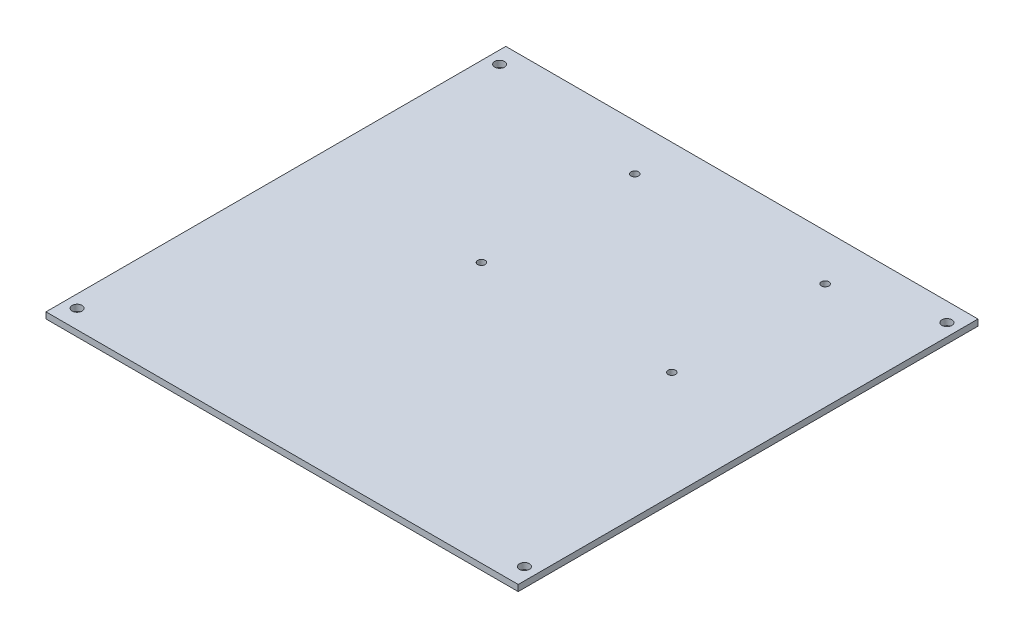
ISO-10303-21;
HEADER;
FILE_DESCRIPTION(('STEP AP214'),'2;1');
FILE_NAME('part.step','',(''),(''),'','','');
FILE_SCHEMA(('AUTOMOTIVE_DESIGN { 1 0 10303 214 1 1 1 1 }'));
ENDSEC;
DATA;
#1=APPLICATION_CONTEXT('core data for automotive mechanical design processes');
#2=APPLICATION_PROTOCOL_DEFINITION('international standard','automotive_design',2000,#1);
#3=PRODUCT_CONTEXT('',#1,'mechanical');
#4=PRODUCT('Part','Part','',(#3));
#5=PRODUCT_RELATED_PRODUCT_CATEGORY('part','',(#4));
#6=PRODUCT_DEFINITION_FORMATION('','',#4);
#7=PRODUCT_DEFINITION_CONTEXT('part definition',#1,'design');
#8=PRODUCT_DEFINITION('design','',#6,#7);
#9=PRODUCT_DEFINITION_SHAPE('','',#8);
#10=(LENGTH_UNIT() NAMED_UNIT(*) SI_UNIT(.MILLI.,.METRE.));
#11=(NAMED_UNIT(*) PLANE_ANGLE_UNIT() SI_UNIT($,.RADIAN.));
#12=(NAMED_UNIT(*) SI_UNIT($,.STERADIAN.) SOLID_ANGLE_UNIT());
#13=UNCERTAINTY_MEASURE_WITH_UNIT(LENGTH_MEASURE(1.E-05),#10,'distance_accuracy_value','');
#14=(GEOMETRIC_REPRESENTATION_CONTEXT(3) GLOBAL_UNCERTAINTY_ASSIGNED_CONTEXT((#13)) GLOBAL_UNIT_ASSIGNED_CONTEXT((#10,
#11,#12)) REPRESENTATION_CONTEXT('',''));
#15=CARTESIAN_POINT('',(0.,0.,0.));
#16=DIRECTION('',(0.,0.,1.));
#17=DIRECTION('',(1.,0.,0.));
#18=AXIS2_PLACEMENT_3D('',#15,#16,#17);
#19=CARTESIAN_POINT('',(95.,2.5,92.5));
#20=DIRECTION('',(-1.,0.,0.));
#21=DIRECTION('',(0.,0.,1.));
#22=AXIS2_PLACEMENT_3D('',#19,#20,#21);
#23=PLANE('',#22);
#24=DIRECTION('',(0.,0.,-1.));
#25=VECTOR('',#24,1.);
#26=CARTESIAN_POINT('',(95.,0.,92.5));
#27=LINE('',#26,#25);
#28=CARTESIAN_POINT('',(95.,0.,92.5));
#29=VERTEX_POINT('',#28);
#30=CARTESIAN_POINT('',(95.,0.,-92.5));
#31=VERTEX_POINT('',#30);
#32=EDGE_CURVE('E99',#29,#31,#27,.T.);
#33=ORIENTED_EDGE('',*,*,#32,.T.);
#34=DIRECTION('',(0.,-1.,0.));
#35=VECTOR('',#34,1.);
#36=CARTESIAN_POINT('',(95.,2.5,-92.5));
#37=LINE('',#36,#35);
#38=CARTESIAN_POINT('',(95.,2.5,-92.5));
#39=VERTEX_POINT('',#38);
#40=EDGE_CURVE('E11',#39,#31,#37,.T.);
#41=ORIENTED_EDGE('',*,*,#40,.F.);
#42=DIRECTION('',(0.,0.,-1.));
#43=VECTOR('',#42,1.);
#44=CARTESIAN_POINT('',(95.,2.5,92.5));
#45=LINE('',#44,#43);
#46=CARTESIAN_POINT('',(95.,2.5,92.5));
#47=VERTEX_POINT('',#46);
#48=EDGE_CURVE('E86',#47,#39,#45,.T.);
#49=ORIENTED_EDGE('',*,*,#48,.F.);
#50=DIRECTION('',(0.,-1.,0.));
#51=VECTOR('',#50,1.);
#52=CARTESIAN_POINT('',(95.,2.5,92.5));
#53=LINE('',#52,#51);
#54=EDGE_CURVE('E95',#47,#29,#53,.T.);
#55=ORIENTED_EDGE('',*,*,#54,.T.);
#56=EDGE_LOOP('',(#33,#41,#49,#55));
#57=FACE_BOUND('',#56,.T.);
#58=ADVANCED_FACE('F33',(#57),#23,.F.);
#59=CARTESIAN_POINT('',(-95.,2.5,-92.5));
#60=DIRECTION('',(0.,0.,1.));
#61=DIRECTION('',(1.,0.,0.));
#62=AXIS2_PLACEMENT_3D('',#59,#60,#61);
#63=PLANE('',#62);
#64=DIRECTION('',(-1.,0.,0.));
#65=VECTOR('',#64,1.);
#66=CARTESIAN_POINT('',(-95.,0.,-92.5));
#67=LINE('',#66,#65);
#68=CARTESIAN_POINT('',(-95.,0.,-92.5));
#69=VERTEX_POINT('',#68);
#70=EDGE_CURVE('E90',#31,#69,#67,.T.);
#71=ORIENTED_EDGE('',*,*,#70,.T.);
#72=DIRECTION('',(0.,-1.,0.));
#73=VECTOR('',#72,1.);
#74=CARTESIAN_POINT('',(-95.,2.5,-92.5));
#75=LINE('',#74,#73);
#76=CARTESIAN_POINT('',(-95.,2.5,-92.5));
#77=VERTEX_POINT('',#76);
#78=EDGE_CURVE('E42',#77,#69,#75,.T.);
#79=ORIENTED_EDGE('',*,*,#78,.F.);
#80=DIRECTION('',(-1.,0.,0.));
#81=VECTOR('',#80,1.);
#82=CARTESIAN_POINT('',(-95.,2.5,-92.5));
#83=LINE('',#82,#81);
#84=EDGE_CURVE('E81',#39,#77,#83,.T.);
#85=ORIENTED_EDGE('',*,*,#84,.F.);
#86=ORIENTED_EDGE('',*,*,#40,.T.);
#87=EDGE_LOOP('',(#71,#79,#85,#86));
#88=FACE_BOUND('',#87,.T.);
#89=ADVANCED_FACE('F89',(#88),#63,.F.);
#90=CARTESIAN_POINT('',(-95.,2.5,92.5));
#91=DIRECTION('',(1.,0.,0.));
#92=DIRECTION('',(0.,0.,-1.));
#93=AXIS2_PLACEMENT_3D('',#90,#91,#92);
#94=PLANE('',#93);
#95=DIRECTION('',(0.,0.,1.));
#96=VECTOR('',#95,1.);
#97=CARTESIAN_POINT('',(-95.,0.,92.5));
#98=LINE('',#97,#96);
#99=CARTESIAN_POINT('',(-95.,0.,92.5));
#100=VERTEX_POINT('',#99);
#101=EDGE_CURVE('E68',#69,#100,#98,.T.);
#102=ORIENTED_EDGE('',*,*,#101,.T.);
#103=DIRECTION('',(0.,-1.,0.));
#104=VECTOR('',#103,1.);
#105=CARTESIAN_POINT('',(-95.,2.5,92.5));
#106=LINE('',#105,#104);
#107=CARTESIAN_POINT('',(-95.,2.5,92.5));
#108=VERTEX_POINT('',#107);
#109=EDGE_CURVE('E91',#108,#100,#106,.T.);
#110=ORIENTED_EDGE('',*,*,#109,.F.);
#111=DIRECTION('',(0.,0.,1.));
#112=VECTOR('',#111,1.);
#113=CARTESIAN_POINT('',(-95.,2.5,92.5));
#114=LINE('',#113,#112);
#115=EDGE_CURVE('E84',#77,#108,#114,.T.);
#116=ORIENTED_EDGE('',*,*,#115,.F.);
#117=ORIENTED_EDGE('',*,*,#78,.T.);
#118=EDGE_LOOP('',(#102,#110,#116,#117));
#119=FACE_BOUND('',#118,.T.);
#120=ADVANCED_FACE('F93',(#119),#94,.F.);
#121=CARTESIAN_POINT('',(-95.,2.5,92.5));
#122=DIRECTION('',(0.,0.,-1.));
#123=DIRECTION('',(-1.,0.,0.));
#124=AXIS2_PLACEMENT_3D('',#121,#122,#123);
#125=PLANE('',#124);
#126=DIRECTION('',(1.,0.,0.));
#127=VECTOR('',#126,1.);
#128=CARTESIAN_POINT('',(-95.,0.,92.5));
#129=LINE('',#128,#127);
#130=EDGE_CURVE('E74',#100,#29,#129,.T.);
#131=ORIENTED_EDGE('',*,*,#130,.T.);
#132=ORIENTED_EDGE('',*,*,#54,.F.);
#133=DIRECTION('',(1.,0.,0.));
#134=VECTOR('',#133,1.);
#135=CARTESIAN_POINT('',(-95.,2.5,92.5));
#136=LINE('',#135,#134);
#137=EDGE_CURVE('E51',#108,#47,#136,.T.);
#138=ORIENTED_EDGE('',*,*,#137,.F.);
#139=ORIENTED_EDGE('',*,*,#109,.T.);
#140=EDGE_LOOP('',(#131,#132,#138,#139));
#141=FACE_BOUND('',#140,.T.);
#142=ADVANCED_FACE('F154',(#141),#125,.F.);
#143=CARTESIAN_POINT('',(0.,2.5,0.));
#144=DIRECTION('',(0.,-1.,0.));
#145=DIRECTION('',(0.,0.,-1.));
#146=AXIS2_PLACEMENT_3D('',#143,#144,#145);
#147=PLANE('',#146);
#148=CARTESIAN_POINT('',(52.0000000000007,2.5,-12.3));
#149=DIRECTION('',(0.,1.,0.));
#150=DIRECTION('',(0.,0.,1.));
#151=AXIS2_PLACEMENT_3D('',#148,#149,#150);
#152=CIRCLE('',#151,1.5);
#153=CARTESIAN_POINT('',(52.0000000000007,2.5,-10.8));
#154=VERTEX_POINT('',#153);
#155=EDGE_CURVE('E276',#154,#154,#152,.T.);
#156=ORIENTED_EDGE('',*,*,#155,.F.);
#157=EDGE_LOOP('',(#156));
#158=FACE_BOUND('',#157,.T.);
#159=CARTESIAN_POINT('',(-24.5999999999993,2.5,-12.2999999999994));
#160=DIRECTION('',(0.,1.,0.));
#161=DIRECTION('',(0.,0.,1.));
#162=AXIS2_PLACEMENT_3D('',#159,#160,#161);
#163=CIRCLE('',#162,1.5);
#164=CARTESIAN_POINT('',(-24.5999999999993,2.5,-10.7999999999994));
#165=VERTEX_POINT('',#164);
#166=EDGE_CURVE('E277',#165,#165,#163,.T.);
#167=ORIENTED_EDGE('',*,*,#166,.F.);
#168=EDGE_LOOP('',(#167));
#169=FACE_BOUND('',#168,.T.);
#170=CARTESIAN_POINT('',(-24.6,2.5,-73.9999999999994));
#171=DIRECTION('',(0.,1.,0.));
#172=DIRECTION('',(0.,0.,1.));
#173=AXIS2_PLACEMENT_3D('',#170,#171,#172);
#174=CIRCLE('',#173,1.5);
#175=CARTESIAN_POINT('',(-24.6,2.5,-72.4999999999994));
#176=VERTEX_POINT('',#175);
#177=EDGE_CURVE('E279',#176,#176,#174,.T.);
#178=ORIENTED_EDGE('',*,*,#177,.F.);
#179=EDGE_LOOP('',(#178));
#180=FACE_BOUND('',#179,.T.);
#181=CARTESIAN_POINT('',(52.,2.5,-74.));
#182=DIRECTION('',(0.,1.,0.));
#183=DIRECTION('',(0.,0.,1.));
#184=AXIS2_PLACEMENT_3D('',#181,#182,#183);
#185=CIRCLE('',#184,1.5);
#186=CARTESIAN_POINT('',(52.,2.5,-72.5));
#187=VERTEX_POINT('',#186);
#188=EDGE_CURVE('E124',#187,#187,#185,.T.);
#189=ORIENTED_EDGE('',*,*,#188,.F.);
#190=EDGE_LOOP('',(#189));
#191=FACE_BOUND('',#190,.T.);
#192=CARTESIAN_POINT('',(-90.,2.5,85.));
#193=DIRECTION('',(0.,1.,0.));
#194=DIRECTION('',(0.,0.,1.));
#195=AXIS2_PLACEMENT_3D('',#192,#193,#194);
#196=CIRCLE('',#195,2.);
#197=CARTESIAN_POINT('',(-90.,2.5,87.));
#198=VERTEX_POINT('',#197);
#199=EDGE_CURVE('E140',#198,#198,#196,.T.);
#200=ORIENTED_EDGE('',*,*,#199,.F.);
#201=EDGE_LOOP('',(#200));
#202=FACE_BOUND('',#201,.T.);
#203=CARTESIAN_POINT('',(90.,2.5,-85.));
#204=DIRECTION('',(0.,1.,0.));
#205=DIRECTION('',(0.,0.,-1.));
#206=AXIS2_PLACEMENT_3D('',#203,#204,#205);
#207=CIRCLE('',#206,2.);
#208=CARTESIAN_POINT('',(90.,2.5,-87.));
#209=VERTEX_POINT('',#208);
#210=EDGE_CURVE('E135',#209,#209,#207,.T.);
#211=ORIENTED_EDGE('',*,*,#210,.F.);
#212=EDGE_LOOP('',(#211));
#213=FACE_BOUND('',#212,.T.);
#214=CARTESIAN_POINT('',(90.,2.5,85.));
#215=DIRECTION('',(0.,1.,0.));
#216=DIRECTION('',(0.,0.,-1.));
#217=AXIS2_PLACEMENT_3D('',#214,#215,#216);
#218=CIRCLE('',#217,2.);
#219=CARTESIAN_POINT('',(90.,2.5,83.));
#220=VERTEX_POINT('',#219);
#221=EDGE_CURVE('E131',#220,#220,#218,.T.);
#222=ORIENTED_EDGE('',*,*,#221,.F.);
#223=EDGE_LOOP('',(#222));
#224=FACE_BOUND('',#223,.T.);
#225=CARTESIAN_POINT('',(-90.,2.5,-85.));
#226=DIRECTION('',(0.,1.,0.));
#227=DIRECTION('',(0.,0.,1.));
#228=AXIS2_PLACEMENT_3D('',#225,#226,#227);
#229=CIRCLE('',#228,2.);
#230=CARTESIAN_POINT('',(-90.,2.5,-83.));
#231=VERTEX_POINT('',#230);
#232=EDGE_CURVE('E112',#231,#231,#229,.T.);
#233=ORIENTED_EDGE('',*,*,#232,.F.);
#234=EDGE_LOOP('',(#233));
#235=FACE_BOUND('',#234,.T.);
#236=ORIENTED_EDGE('',*,*,#48,.T.);
#237=ORIENTED_EDGE('',*,*,#84,.T.);
#238=ORIENTED_EDGE('',*,*,#115,.T.);
#239=ORIENTED_EDGE('',*,*,#137,.T.);
#240=EDGE_LOOP('',(#236,#237,#238,#239));
#241=FACE_BOUND('',#240,.T.);
#242=ADVANCED_FACE('F82',(#158,#169,#180,#191,#202,#213,#224,#235,#241),#147,.F.);
#243=CARTESIAN_POINT('',(0.,0.,0.));
#244=DIRECTION('',(0.,-1.,0.));
#245=DIRECTION('',(0.,0.,-1.));
#246=AXIS2_PLACEMENT_3D('',#243,#244,#245);
#247=PLANE('',#246);
#248=CARTESIAN_POINT('',(52.0000000000007,0.,-12.3));
#249=DIRECTION('',(0.,-1.,0.));
#250=DIRECTION('',(0.,0.,-1.));
#251=AXIS2_PLACEMENT_3D('',#248,#249,#250);
#252=CIRCLE('',#251,1.5);
#253=CARTESIAN_POINT('',(52.0000000000007,0.,-13.8));
#254=VERTEX_POINT('',#253);
#255=EDGE_CURVE('E36',#254,#254,#252,.T.);
#256=ORIENTED_EDGE('',*,*,#255,.F.);
#257=EDGE_LOOP('',(#256));
#258=FACE_BOUND('',#257,.T.);
#259=CARTESIAN_POINT('',(-24.5999999999993,0.,-12.2999999999994));
#260=DIRECTION('',(0.,-1.,0.));
#261=DIRECTION('',(0.,0.,-1.));
#262=AXIS2_PLACEMENT_3D('',#259,#260,#261);
#263=CIRCLE('',#262,1.5);
#264=CARTESIAN_POINT('',(-24.5999999999993,0.,-13.7999999999994));
#265=VERTEX_POINT('',#264);
#266=EDGE_CURVE('E126',#265,#265,#263,.T.);
#267=ORIENTED_EDGE('',*,*,#266,.F.);
#268=EDGE_LOOP('',(#267));
#269=FACE_BOUND('',#268,.T.);
#270=CARTESIAN_POINT('',(-24.6,0.,-73.9999999999994));
#271=DIRECTION('',(0.,-1.,0.));
#272=DIRECTION('',(0.,0.,-1.));
#273=AXIS2_PLACEMENT_3D('',#270,#271,#272);
#274=CIRCLE('',#273,1.5);
#275=CARTESIAN_POINT('',(-24.6,0.,-75.4999999999994));
#276=VERTEX_POINT('',#275);
#277=EDGE_CURVE('E123',#276,#276,#274,.T.);
#278=ORIENTED_EDGE('',*,*,#277,.F.);
#279=EDGE_LOOP('',(#278));
#280=FACE_BOUND('',#279,.T.);
#281=CARTESIAN_POINT('',(52.,0.,-74.));
#282=DIRECTION('',(0.,-1.,0.));
#283=DIRECTION('',(0.,0.,-1.));
#284=AXIS2_PLACEMENT_3D('',#281,#282,#283);
#285=CIRCLE('',#284,1.5);
#286=CARTESIAN_POINT('',(52.,0.,-75.5));
#287=VERTEX_POINT('',#286);
#288=EDGE_CURVE('E120',#287,#287,#285,.T.);
#289=ORIENTED_EDGE('',*,*,#288,.F.);
#290=EDGE_LOOP('',(#289));
#291=FACE_BOUND('',#290,.T.);
#292=CARTESIAN_POINT('',(-90.,0.,85.));
#293=DIRECTION('',(0.,-1.,0.));
#294=DIRECTION('',(0.,0.,-1.));
#295=AXIS2_PLACEMENT_3D('',#292,#293,#294);
#296=CIRCLE('',#295,2.);
#297=CARTESIAN_POINT('',(-90.,0.,83.));
#298=VERTEX_POINT('',#297);
#299=EDGE_CURVE('E102',#298,#298,#296,.T.);
#300=ORIENTED_EDGE('',*,*,#299,.F.);
#301=EDGE_LOOP('',(#300));
#302=FACE_BOUND('',#301,.T.);
#303=CARTESIAN_POINT('',(90.,0.,-85.));
#304=DIRECTION('',(0.,-1.,0.));
#305=DIRECTION('',(0.,0.,-1.));
#306=AXIS2_PLACEMENT_3D('',#303,#304,#305);
#307=CIRCLE('',#306,2.);
#308=CARTESIAN_POINT('',(90.,0.,-87.));
#309=VERTEX_POINT('',#308);
#310=EDGE_CURVE('E115',#309,#309,#307,.T.);
#311=ORIENTED_EDGE('',*,*,#310,.F.);
#312=EDGE_LOOP('',(#311));
#313=FACE_BOUND('',#312,.T.);
#314=CARTESIAN_POINT('',(90.,0.,85.));
#315=DIRECTION('',(0.,-1.,0.));
#316=DIRECTION('',(0.,0.,-1.));
#317=AXIS2_PLACEMENT_3D('',#314,#315,#316);
#318=CIRCLE('',#317,2.);
#319=CARTESIAN_POINT('',(90.,0.,83.));
#320=VERTEX_POINT('',#319);
#321=EDGE_CURVE('E111',#320,#320,#318,.T.);
#322=ORIENTED_EDGE('',*,*,#321,.F.);
#323=EDGE_LOOP('',(#322));
#324=FACE_BOUND('',#323,.T.);
#325=CARTESIAN_POINT('',(-90.,0.,-85.));
#326=DIRECTION('',(0.,-1.,0.));
#327=DIRECTION('',(0.,0.,-1.));
#328=AXIS2_PLACEMENT_3D('',#325,#326,#327);
#329=CIRCLE('',#328,2.);
#330=CARTESIAN_POINT('',(-90.,0.,-87.));
#331=VERTEX_POINT('',#330);
#332=EDGE_CURVE('E108',#331,#331,#329,.T.);
#333=ORIENTED_EDGE('',*,*,#332,.F.);
#334=EDGE_LOOP('',(#333));
#335=FACE_BOUND('',#334,.T.);
#336=ORIENTED_EDGE('',*,*,#32,.F.);
#337=ORIENTED_EDGE('',*,*,#130,.F.);
#338=ORIENTED_EDGE('',*,*,#101,.F.);
#339=ORIENTED_EDGE('',*,*,#70,.F.);
#340=EDGE_LOOP('',(#336,#337,#338,#339));
#341=FACE_BOUND('',#340,.T.);
#342=ADVANCED_FACE('F153',(#258,#269,#280,#291,#302,#313,#324,#335,#341),#247,.T.);
#343=CARTESIAN_POINT('',(-90.,-7.5,-85.));
#344=DIRECTION('',(0.,1.,0.));
#345=DIRECTION('',(0.,0.,1.));
#346=AXIS2_PLACEMENT_3D('',#343,#344,#345);
#347=CYLINDRICAL_SURFACE('',#346,2.);
#348=ORIENTED_EDGE('',*,*,#332,.T.);
#349=EDGE_LOOP('',(#348));
#350=FACE_BOUND('',#349,.T.);
#351=ORIENTED_EDGE('',*,*,#232,.T.);
#352=EDGE_LOOP('',(#351));
#353=FACE_BOUND('',#352,.T.);
#354=ADVANCED_FACE('F150',(#350,#353),#347,.F.);
#355=CARTESIAN_POINT('',(90.,-7.5,85.));
#356=DIRECTION('',(0.,1.,0.));
#357=DIRECTION('',(0.,0.,1.));
#358=AXIS2_PLACEMENT_3D('',#355,#356,#357);
#359=CYLINDRICAL_SURFACE('',#358,2.);
#360=ORIENTED_EDGE('',*,*,#321,.T.);
#361=EDGE_LOOP('',(#360));
#362=FACE_BOUND('',#361,.T.);
#363=ORIENTED_EDGE('',*,*,#221,.T.);
#364=EDGE_LOOP('',(#363));
#365=FACE_BOUND('',#364,.T.);
#366=ADVANCED_FACE('F194',(#362,#365),#359,.F.);
#367=CARTESIAN_POINT('',(90.,-7.5,-85.));
#368=DIRECTION('',(0.,1.,0.));
#369=DIRECTION('',(0.,0.,1.));
#370=AXIS2_PLACEMENT_3D('',#367,#368,#369);
#371=CYLINDRICAL_SURFACE('',#370,2.);
#372=ORIENTED_EDGE('',*,*,#310,.T.);
#373=EDGE_LOOP('',(#372));
#374=FACE_BOUND('',#373,.T.);
#375=ORIENTED_EDGE('',*,*,#210,.T.);
#376=EDGE_LOOP('',(#375));
#377=FACE_BOUND('',#376,.T.);
#378=ADVANCED_FACE('F204',(#374,#377),#371,.F.);
#379=CARTESIAN_POINT('',(-90.,-7.5,85.));
#380=DIRECTION('',(0.,1.,0.));
#381=DIRECTION('',(0.,0.,1.));
#382=AXIS2_PLACEMENT_3D('',#379,#380,#381);
#383=CYLINDRICAL_SURFACE('',#382,2.);
#384=ORIENTED_EDGE('',*,*,#299,.T.);
#385=EDGE_LOOP('',(#384));
#386=FACE_BOUND('',#385,.T.);
#387=ORIENTED_EDGE('',*,*,#199,.T.);
#388=EDGE_LOOP('',(#387));
#389=FACE_BOUND('',#388,.T.);
#390=ADVANCED_FACE('F214',(#386,#389),#383,.F.);
#391=CARTESIAN_POINT('',(52.,-7.5,-74.));
#392=DIRECTION('',(0.,1.,0.));
#393=DIRECTION('',(0.,0.,1.));
#394=AXIS2_PLACEMENT_3D('',#391,#392,#393);
#395=CYLINDRICAL_SURFACE('',#394,1.5);
#396=ORIENTED_EDGE('',*,*,#288,.T.);
#397=EDGE_LOOP('',(#396));
#398=FACE_BOUND('',#397,.T.);
#399=ORIENTED_EDGE('',*,*,#188,.T.);
#400=EDGE_LOOP('',(#399));
#401=FACE_BOUND('',#400,.T.);
#402=ADVANCED_FACE('F223',(#398,#401),#395,.F.);
#403=CARTESIAN_POINT('',(-24.6,-7.5,-73.9999999999994));
#404=DIRECTION('',(0.,1.,0.));
#405=DIRECTION('',(0.,0.,1.));
#406=AXIS2_PLACEMENT_3D('',#403,#404,#405);
#407=CYLINDRICAL_SURFACE('',#406,1.5);
#408=ORIENTED_EDGE('',*,*,#277,.T.);
#409=EDGE_LOOP('',(#408));
#410=FACE_BOUND('',#409,.T.);
#411=ORIENTED_EDGE('',*,*,#177,.T.);
#412=EDGE_LOOP('',(#411));
#413=FACE_BOUND('',#412,.T.);
#414=ADVANCED_FACE('F242',(#410,#413),#407,.F.);
#415=CARTESIAN_POINT('',(-24.5999999999993,-7.5,-12.2999999999994));
#416=DIRECTION('',(0.,1.,0.));
#417=DIRECTION('',(0.,0.,1.));
#418=AXIS2_PLACEMENT_3D('',#415,#416,#417);
#419=CYLINDRICAL_SURFACE('',#418,1.5);
#420=ORIENTED_EDGE('',*,*,#266,.T.);
#421=EDGE_LOOP('',(#420));
#422=FACE_BOUND('',#421,.T.);
#423=ORIENTED_EDGE('',*,*,#166,.T.);
#424=EDGE_LOOP('',(#423));
#425=FACE_BOUND('',#424,.T.);
#426=ADVANCED_FACE('F252',(#422,#425),#419,.F.);
#427=CARTESIAN_POINT('',(52.0000000000007,-7.5,-12.3));
#428=DIRECTION('',(0.,1.,0.));
#429=DIRECTION('',(0.,0.,1.));
#430=AXIS2_PLACEMENT_3D('',#427,#428,#429);
#431=CYLINDRICAL_SURFACE('',#430,1.5);
#432=ORIENTED_EDGE('',*,*,#255,.T.);
#433=EDGE_LOOP('',(#432));
#434=FACE_BOUND('',#433,.T.);
#435=ORIENTED_EDGE('',*,*,#155,.T.);
#436=EDGE_LOOP('',(#435));
#437=FACE_BOUND('',#436,.T.);
#438=ADVANCED_FACE('F262',(#434,#437),#431,.F.);
#439=CLOSED_SHELL('',(#58,#89,#120,#142,#242,#342,#354,#366,#378,#390,#402,#414,#426,#438));
#440=MANIFOLD_SOLID_BREP('B2',#439);
#441=ADVANCED_BREP_SHAPE_REPRESENTATION('',(#18,#440),#14);
#442=SHAPE_DEFINITION_REPRESENTATION(#9,#441);
ENDSEC;
END-ISO-10303-21;
